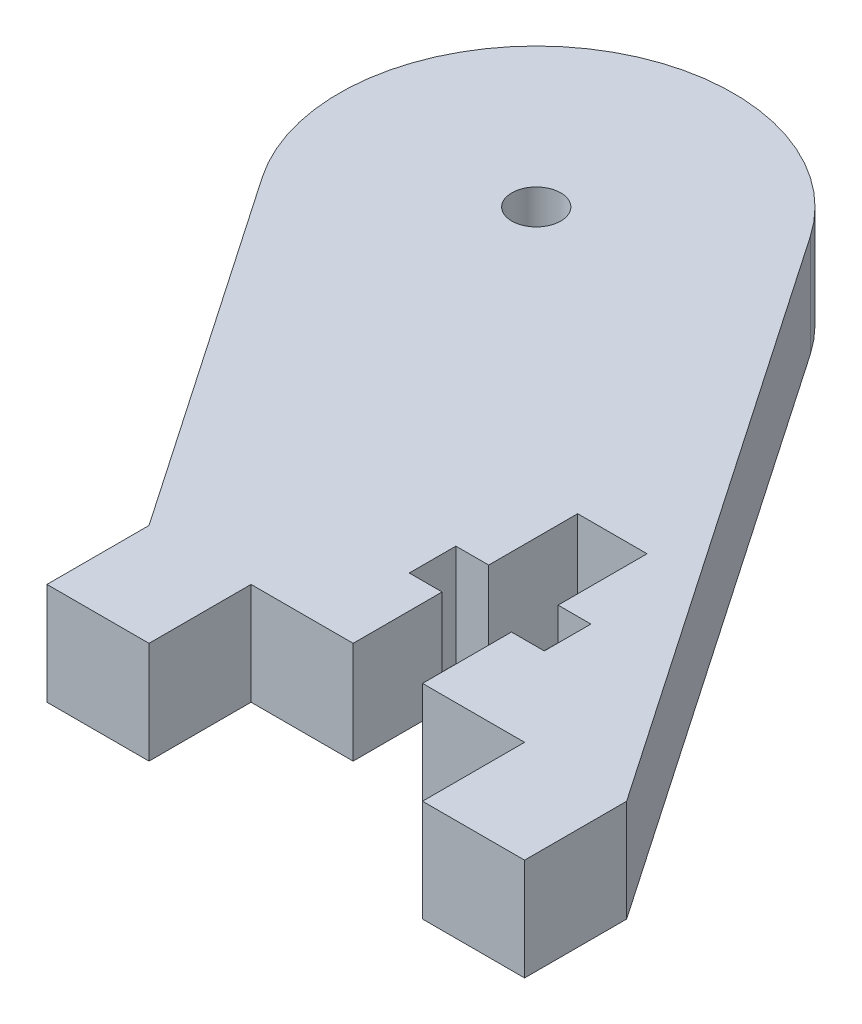
ISO-10303-21;
HEADER;
FILE_DESCRIPTION(('STEP AP214'),'2;1');
FILE_NAME('part.step','',(''),(''),'','','');
FILE_SCHEMA(('AUTOMOTIVE_DESIGN { 1 0 10303 214 1 1 1 1 }'));
ENDSEC;
DATA;
#1=APPLICATION_CONTEXT('core data for automotive mechanical design processes');
#2=APPLICATION_PROTOCOL_DEFINITION('international standard','automotive_design',2000,#1);
#3=PRODUCT_CONTEXT('',#1,'mechanical');
#4=PRODUCT('Part','Part','',(#3));
#5=PRODUCT_RELATED_PRODUCT_CATEGORY('part','',(#4));
#6=PRODUCT_DEFINITION_FORMATION('','',#4);
#7=PRODUCT_DEFINITION_CONTEXT('part definition',#1,'design');
#8=PRODUCT_DEFINITION('design','',#6,#7);
#9=PRODUCT_DEFINITION_SHAPE('','',#8);
#10=(LENGTH_UNIT() NAMED_UNIT(*) SI_UNIT(.MILLI.,.METRE.));
#11=(NAMED_UNIT(*) PLANE_ANGLE_UNIT() SI_UNIT($,.RADIAN.));
#12=(NAMED_UNIT(*) SI_UNIT($,.STERADIAN.) SOLID_ANGLE_UNIT());
#13=UNCERTAINTY_MEASURE_WITH_UNIT(LENGTH_MEASURE(1.E-05),#10,'distance_accuracy_value','');
#14=(GEOMETRIC_REPRESENTATION_CONTEXT(3) GLOBAL_UNCERTAINTY_ASSIGNED_CONTEXT((#13)) GLOBAL_UNIT_ASSIGNED_CONTEXT((#10,
#11,#12)) REPRESENTATION_CONTEXT('',''));
#15=CARTESIAN_POINT('',(0.,0.,0.));
#16=DIRECTION('',(0.,0.,1.));
#17=DIRECTION('',(1.,0.,0.));
#18=AXIS2_PLACEMENT_3D('',#15,#16,#17);
#19=CARTESIAN_POINT('',(0.,6.35,0.));
#20=DIRECTION('',(0.,0.,1.));
#21=DIRECTION('',(1.,0.,0.));
#22=AXIS2_PLACEMENT_3D('',#19,#20,#21);
#23=PLANE('',#22);
#24=DIRECTION('',(-1.,0.,0.));
#25=VECTOR('',#24,1.);
#26=CARTESIAN_POINT('',(0.,0.,0.));
#27=LINE('',#26,#25);
#28=CARTESIAN_POINT('',(23.368,0.,0.));
#29=VERTEX_POINT('',#28);
#30=CARTESIAN_POINT('',(17.018,0.,0.));
#31=VERTEX_POINT('',#30);
#32=EDGE_CURVE('E272',#29,#31,#27,.T.);
#33=ORIENTED_EDGE('',*,*,#32,.F.);
#34=DIRECTION('',(0.,-1.,0.));
#35=VECTOR('',#34,1.);
#36=CARTESIAN_POINT('',(23.368,6.35,0.));
#37=LINE('',#36,#35);
#38=CARTESIAN_POINT('',(23.368,6.35,0.));
#39=VERTEX_POINT('',#38);
#40=EDGE_CURVE('E11',#39,#29,#37,.T.);
#41=ORIENTED_EDGE('',*,*,#40,.F.);
#42=DIRECTION('',(-1.,0.,0.));
#43=VECTOR('',#42,1.);
#44=CARTESIAN_POINT('',(0.,6.35,0.));
#45=LINE('',#44,#43);
#46=CARTESIAN_POINT('',(17.018,6.35,0.));
#47=VERTEX_POINT('',#46);
#48=EDGE_CURVE('E429',#39,#47,#45,.T.);
#49=ORIENTED_EDGE('',*,*,#48,.T.);
#50=DIRECTION('',(0.,-1.,0.));
#51=VECTOR('',#50,1.);
#52=CARTESIAN_POINT('',(17.018,6.35,0.));
#53=LINE('',#52,#51);
#54=EDGE_CURVE('E128',#47,#31,#53,.T.);
#55=ORIENTED_EDGE('',*,*,#54,.T.);
#56=EDGE_LOOP('',(#33,#41,#49,#55));
#57=FACE_BOUND('',#56,.T.);
#58=ADVANCED_FACE('F35',(#57),#23,.T.);
#59=CARTESIAN_POINT('',(23.368,6.35,0.));
#60=DIRECTION('',(1.,0.,0.));
#61=DIRECTION('',(0.,0.,-1.));
#62=AXIS2_PLACEMENT_3D('',#59,#60,#61);
#63=PLANE('',#62);
#64=DIRECTION('',(0.,0.,1.));
#65=VECTOR('',#64,1.);
#66=CARTESIAN_POINT('',(23.368,0.,0.));
#67=LINE('',#66,#65);
#68=CARTESIAN_POINT('',(23.368,0.,6.35000000000002));
#69=VERTEX_POINT('',#68);
#70=EDGE_CURVE('E270',#29,#69,#67,.T.);
#71=ORIENTED_EDGE('',*,*,#70,.T.);
#72=DIRECTION('',(0.,-1.,0.));
#73=VECTOR('',#72,1.);
#74=CARTESIAN_POINT('',(23.368,6.35,6.35000000000002));
#75=LINE('',#74,#73);
#76=CARTESIAN_POINT('',(23.368,6.35,6.35000000000002));
#77=VERTEX_POINT('',#76);
#78=EDGE_CURVE('E44',#77,#69,#75,.T.);
#79=ORIENTED_EDGE('',*,*,#78,.F.);
#80=DIRECTION('',(0.,0.,1.));
#81=VECTOR('',#80,1.);
#82=CARTESIAN_POINT('',(23.368,6.35,0.));
#83=LINE('',#82,#81);
#84=EDGE_CURVE('E431',#39,#77,#83,.T.);
#85=ORIENTED_EDGE('',*,*,#84,.F.);
#86=ORIENTED_EDGE('',*,*,#40,.T.);
#87=EDGE_LOOP('',(#71,#79,#85,#86));
#88=FACE_BOUND('',#87,.T.);
#89=ADVANCED_FACE('F271',(#88),#63,.F.);
#90=CARTESIAN_POINT('',(0.,6.35,6.35));
#91=DIRECTION('',(0.,0.,-1.));
#92=DIRECTION('',(-1.,0.,0.));
#93=AXIS2_PLACEMENT_3D('',#90,#91,#92);
#94=PLANE('',#93);
#95=DIRECTION('',(1.,0.,0.));
#96=VECTOR('',#95,1.);
#97=CARTESIAN_POINT('',(0.,0.,6.35));
#98=LINE('',#97,#96);
#99=CARTESIAN_POINT('',(29.718,0.,6.35000000000002));
#100=VERTEX_POINT('',#99);
#101=EDGE_CURVE('E264',#69,#100,#98,.T.);
#102=ORIENTED_EDGE('',*,*,#101,.T.);
#103=DIRECTION('',(0.,-1.,0.));
#104=VECTOR('',#103,1.);
#105=CARTESIAN_POINT('',(29.718,6.35,6.35000000000002));
#106=LINE('',#105,#104);
#107=CARTESIAN_POINT('',(29.718,6.35,6.35000000000002));
#108=VERTEX_POINT('',#107);
#109=EDGE_CURVE('E255',#108,#100,#106,.T.);
#110=ORIENTED_EDGE('',*,*,#109,.F.);
#111=DIRECTION('',(1.,0.,0.));
#112=VECTOR('',#111,1.);
#113=CARTESIAN_POINT('',(0.,6.35,6.35));
#114=LINE('',#113,#112);
#115=EDGE_CURVE('E266',#77,#108,#114,.T.);
#116=ORIENTED_EDGE('',*,*,#115,.F.);
#117=ORIENTED_EDGE('',*,*,#78,.T.);
#118=EDGE_LOOP('',(#102,#110,#116,#117));
#119=FACE_BOUND('',#118,.T.);
#120=ADVANCED_FACE('F262',(#119),#94,.F.);
#121=CARTESIAN_POINT('',(29.718,6.35,0.));
#122=DIRECTION('',(-1.,0.,0.));
#123=DIRECTION('',(0.,0.,1.));
#124=AXIS2_PLACEMENT_3D('',#121,#122,#123);
#125=PLANE('',#124);
#126=DIRECTION('',(0.,0.,-1.));
#127=VECTOR('',#126,1.);
#128=CARTESIAN_POINT('',(29.718,0.,0.));
#129=LINE('',#128,#127);
#130=CARTESIAN_POINT('',(29.718,0.,0.));
#131=VERTEX_POINT('',#130);
#132=EDGE_CURVE('E274',#100,#131,#129,.T.);
#133=ORIENTED_EDGE('',*,*,#132,.T.);
#134=DIRECTION('',(0.,-1.,0.));
#135=VECTOR('',#134,1.);
#136=CARTESIAN_POINT('',(29.718,6.35,0.));
#137=LINE('',#136,#135);
#138=CARTESIAN_POINT('',(29.718,6.35,0.));
#139=VERTEX_POINT('',#138);
#140=EDGE_CURVE('E252',#139,#131,#137,.T.);
#141=ORIENTED_EDGE('',*,*,#140,.F.);
#142=DIRECTION('',(0.,0.,-1.));
#143=VECTOR('',#142,1.);
#144=CARTESIAN_POINT('',(29.718,6.35,0.));
#145=LINE('',#144,#143);
#146=EDGE_CURVE('E436',#108,#139,#145,.T.);
#147=ORIENTED_EDGE('',*,*,#146,.F.);
#148=ORIENTED_EDGE('',*,*,#109,.T.);
#149=EDGE_LOOP('',(#133,#141,#147,#148));
#150=FACE_BOUND('',#149,.T.);
#151=ADVANCED_FACE('F356',(#150),#125,.F.);
#152=CARTESIAN_POINT('',(20.2492592973143,6.35,-13.8468402788404));
#153=DIRECTION('',(-0.82545762131413,0.,0.564464095770864));
#154=DIRECTION('',(0.564464095770864,0.,0.82545762131413));
#155=AXIS2_PLACEMENT_3D('',#152,#153,#154);
#156=PLANE('',#155);
#157=DIRECTION('',(-0.564464095770864,0.,-0.82545762131413));
#158=VECTOR('',#157,1.);
#159=CARTESIAN_POINT('',(20.2492592973143,0.,-13.8468402788404));
#160=LINE('',#159,#158);
#161=CARTESIAN_POINT('',(5.00925929731432,0.,-36.1334201394202));
#162=VERTEX_POINT('',#161);
#163=EDGE_CURVE('E282',#131,#162,#160,.T.);
#164=ORIENTED_EDGE('',*,*,#163,.T.);
#165=DIRECTION('',(0.,-1.,0.));
#166=VECTOR('',#165,1.);
#167=CARTESIAN_POINT('',(5.00925929731432,6.35,-36.1334201394202));
#168=LINE('',#167,#166);
#169=CARTESIAN_POINT('',(5.00925929731432,6.35,-36.1334201394202));
#170=VERTEX_POINT('',#169);
#171=EDGE_CURVE('E250',#170,#162,#168,.T.);
#172=ORIENTED_EDGE('',*,*,#171,.F.);
#173=DIRECTION('',(-0.564464095770864,0.,-0.82545762131413));
#174=VECTOR('',#173,1.);
#175=CARTESIAN_POINT('',(20.2492592973143,6.35,-13.8468402788404));
#176=LINE('',#175,#174);
#177=EDGE_CURVE('E439',#139,#170,#176,.T.);
#178=ORIENTED_EDGE('',*,*,#177,.F.);
#179=ORIENTED_EDGE('',*,*,#140,.T.);
#180=EDGE_LOOP('',(#164,#172,#178,#179));
#181=FACE_BOUND('',#180,.T.);
#182=ADVANCED_FACE('F359',(#181),#156,.F.);
#183=CARTESIAN_POINT('',(-5.11537035134283,6.35,-29.21));
#184=DIRECTION('',(0.,-1.,0.));
#185=DIRECTION('',(0.,0.,-1.));
#186=AXIS2_PLACEMENT_3D('',#183,#184,#185);
#187=CYLINDRICAL_SURFACE('',#186,12.2654747951066);
#188=CARTESIAN_POINT('',(-5.11537035134283,0.,-29.21));
#189=DIRECTION('',(0.,1.,0.));
#190=DIRECTION('',(0.,0.,1.));
#191=AXIS2_PLACEMENT_3D('',#188,#189,#190);
#192=CIRCLE('',#191,12.2654747951066);
#193=CARTESIAN_POINT('',(-15.24,0.,-22.2865798605798));
#194=VERTEX_POINT('',#193);
#195=EDGE_CURVE('E285',#194,#162,#192,.F.);
#196=ORIENTED_EDGE('',*,*,#195,.F.);
#197=DIRECTION('',(0.,-1.,0.));
#198=VECTOR('',#197,1.);
#199=CARTESIAN_POINT('',(-15.24,6.35,-22.2865798605798));
#200=LINE('',#199,#198);
#201=CARTESIAN_POINT('',(-15.24,6.35,-22.2865798605798));
#202=VERTEX_POINT('',#201);
#203=EDGE_CURVE('E248',#202,#194,#200,.T.);
#204=ORIENTED_EDGE('',*,*,#203,.F.);
#205=CARTESIAN_POINT('',(-5.11537035134283,6.35,-29.21));
#206=DIRECTION('',(0.,1.,0.));
#207=DIRECTION('',(0.,0.,1.));
#208=AXIS2_PLACEMENT_3D('',#205,#206,#207);
#209=CIRCLE('',#208,12.2654747951066);
#210=EDGE_CURVE('E441',#202,#170,#209,.F.);
#211=ORIENTED_EDGE('',*,*,#210,.T.);
#212=ORIENTED_EDGE('',*,*,#171,.T.);
#213=EDGE_LOOP('',(#196,#204,#211,#212));
#214=FACE_BOUND('',#213,.T.);
#215=ADVANCED_FACE('F363',(#214),#187,.T.);
#216=CARTESIAN_POINT('',(0.,6.35,0.));
#217=DIRECTION('',(-0.82545762131413,0.,0.564464095770864));
#218=DIRECTION('',(0.564464095770864,0.,0.82545762131413));
#219=AXIS2_PLACEMENT_3D('',#216,#217,#218);
#220=PLANE('',#219);
#221=DIRECTION('',(-0.564464095770864,0.,-0.82545762131413));
#222=VECTOR('',#221,1.);
#223=CARTESIAN_POINT('',(0.,0.,0.));
#224=LINE('',#223,#222);
#225=CARTESIAN_POINT('',(0.,0.,0.));
#226=VERTEX_POINT('',#225);
#227=EDGE_CURVE('E288',#226,#194,#224,.T.);
#228=ORIENTED_EDGE('',*,*,#227,.F.);
#229=DIRECTION('',(0.,-1.,0.));
#230=VECTOR('',#229,1.);
#231=CARTESIAN_POINT('',(0.,6.35,0.));
#232=LINE('',#231,#230);
#233=CARTESIAN_POINT('',(0.,6.35,0.));
#234=VERTEX_POINT('',#233);
#235=EDGE_CURVE('E246',#234,#226,#232,.T.);
#236=ORIENTED_EDGE('',*,*,#235,.F.);
#237=DIRECTION('',(-0.564464095770864,0.,-0.82545762131413));
#238=VECTOR('',#237,1.);
#239=CARTESIAN_POINT('',(0.,6.35,0.));
#240=LINE('',#239,#238);
#241=EDGE_CURVE('E444',#234,#202,#240,.T.);
#242=ORIENTED_EDGE('',*,*,#241,.T.);
#243=ORIENTED_EDGE('',*,*,#203,.T.);
#244=EDGE_LOOP('',(#228,#236,#242,#243));
#245=FACE_BOUND('',#244,.T.);
#246=ADVANCED_FACE('F367',(#245),#220,.T.);
#247=CARTESIAN_POINT('',(0.,6.35,0.));
#248=DIRECTION('',(-1.,0.,0.));
#249=DIRECTION('',(0.,0.,1.));
#250=AXIS2_PLACEMENT_3D('',#247,#248,#249);
#251=PLANE('',#250);
#252=DIRECTION('',(0.,0.,-1.));
#253=VECTOR('',#252,1.);
#254=CARTESIAN_POINT('',(0.,0.,0.));
#255=LINE('',#254,#253);
#256=CARTESIAN_POINT('',(0.,0.,6.35));
#257=VERTEX_POINT('',#256);
#258=EDGE_CURVE('E291',#257,#226,#255,.T.);
#259=ORIENTED_EDGE('',*,*,#258,.F.);
#260=DIRECTION('',(0.,-1.,0.));
#261=VECTOR('',#260,1.);
#262=CARTESIAN_POINT('',(0.,6.35,6.35));
#263=LINE('',#262,#261);
#264=CARTESIAN_POINT('',(0.,6.35,6.35));
#265=VERTEX_POINT('',#264);
#266=EDGE_CURVE('E244',#265,#257,#263,.T.);
#267=ORIENTED_EDGE('',*,*,#266,.F.);
#268=DIRECTION('',(0.,0.,-1.));
#269=VECTOR('',#268,1.);
#270=CARTESIAN_POINT('',(0.,6.35,0.));
#271=LINE('',#270,#269);
#272=EDGE_CURVE('E447',#265,#234,#271,.T.);
#273=ORIENTED_EDGE('',*,*,#272,.T.);
#274=ORIENTED_EDGE('',*,*,#235,.T.);
#275=EDGE_LOOP('',(#259,#267,#273,#274));
#276=FACE_BOUND('',#275,.T.);
#277=ADVANCED_FACE('F371',(#276),#251,.T.);
#278=CARTESIAN_POINT('',(0.,6.35,6.35));
#279=DIRECTION('',(0.,0.,1.));
#280=DIRECTION('',(1.,0.,0.));
#281=AXIS2_PLACEMENT_3D('',#278,#279,#280);
#282=PLANE('',#281);
#283=DIRECTION('',(-1.,0.,0.));
#284=VECTOR('',#283,1.);
#285=CARTESIAN_POINT('',(0.,0.,6.35));
#286=LINE('',#285,#284);
#287=CARTESIAN_POINT('',(6.35,0.,6.35));
#288=VERTEX_POINT('',#287);
#289=EDGE_CURVE('E294',#288,#257,#286,.T.);
#290=ORIENTED_EDGE('',*,*,#289,.F.);
#291=DIRECTION('',(0.,-1.,0.));
#292=VECTOR('',#291,1.);
#293=CARTESIAN_POINT('',(6.35,6.35,6.35));
#294=LINE('',#293,#292);
#295=CARTESIAN_POINT('',(6.35,6.35,6.35));
#296=VERTEX_POINT('',#295);
#297=EDGE_CURVE('E242',#296,#288,#294,.T.);
#298=ORIENTED_EDGE('',*,*,#297,.F.);
#299=DIRECTION('',(-1.,0.,0.));
#300=VECTOR('',#299,1.);
#301=CARTESIAN_POINT('',(0.,6.35,6.35));
#302=LINE('',#301,#300);
#303=EDGE_CURVE('E450',#296,#265,#302,.T.);
#304=ORIENTED_EDGE('',*,*,#303,.T.);
#305=ORIENTED_EDGE('',*,*,#266,.T.);
#306=EDGE_LOOP('',(#290,#298,#304,#305));
#307=FACE_BOUND('',#306,.T.);
#308=ADVANCED_FACE('F375',(#307),#282,.T.);
#309=CARTESIAN_POINT('',(6.35,6.35,0.));
#310=DIRECTION('',(1.,0.,0.));
#311=DIRECTION('',(0.,0.,-1.));
#312=AXIS2_PLACEMENT_3D('',#309,#310,#311);
#313=PLANE('',#312);
#314=DIRECTION('',(0.,0.,1.));
#315=VECTOR('',#314,1.);
#316=CARTESIAN_POINT('',(6.35,0.,0.));
#317=LINE('',#316,#315);
#318=CARTESIAN_POINT('',(6.35,0.,0.));
#319=VERTEX_POINT('',#318);
#320=EDGE_CURVE('E297',#319,#288,#317,.T.);
#321=ORIENTED_EDGE('',*,*,#320,.F.);
#322=DIRECTION('',(0.,-1.,0.));
#323=VECTOR('',#322,1.);
#324=CARTESIAN_POINT('',(6.35,6.35,0.));
#325=LINE('',#324,#323);
#326=CARTESIAN_POINT('',(6.35,6.35,0.));
#327=VERTEX_POINT('',#326);
#328=EDGE_CURVE('E240',#327,#319,#325,.T.);
#329=ORIENTED_EDGE('',*,*,#328,.F.);
#330=DIRECTION('',(0.,0.,1.));
#331=VECTOR('',#330,1.);
#332=CARTESIAN_POINT('',(6.35,6.35,0.));
#333=LINE('',#332,#331);
#334=EDGE_CURVE('E453',#327,#296,#333,.T.);
#335=ORIENTED_EDGE('',*,*,#334,.T.);
#336=ORIENTED_EDGE('',*,*,#297,.T.);
#337=EDGE_LOOP('',(#321,#329,#335,#336));
#338=FACE_BOUND('',#337,.T.);
#339=ADVANCED_FACE('F379',(#338),#313,.T.);
#340=CARTESIAN_POINT('',(0.,6.35,0.));
#341=DIRECTION('',(0.,0.,-1.));
#342=DIRECTION('',(-1.,0.,0.));
#343=AXIS2_PLACEMENT_3D('',#340,#341,#342);
#344=PLANE('',#343);
#345=DIRECTION('',(1.,0.,0.));
#346=VECTOR('',#345,1.);
#347=CARTESIAN_POINT('',(0.,0.,0.));
#348=LINE('',#347,#346);
#349=CARTESIAN_POINT('',(12.7,0.,0.));
#350=VERTEX_POINT('',#349);
#351=EDGE_CURVE('E300',#319,#350,#348,.T.);
#352=ORIENTED_EDGE('',*,*,#351,.T.);
#353=DIRECTION('',(0.,-1.,0.));
#354=VECTOR('',#353,1.);
#355=CARTESIAN_POINT('',(12.7,6.35,0.));
#356=LINE('',#355,#354);
#357=CARTESIAN_POINT('',(12.7,6.35,0.));
#358=VERTEX_POINT('',#357);
#359=EDGE_CURVE('E237',#358,#350,#356,.T.);
#360=ORIENTED_EDGE('',*,*,#359,.F.);
#361=DIRECTION('',(1.,0.,0.));
#362=VECTOR('',#361,1.);
#363=CARTESIAN_POINT('',(0.,6.35,0.));
#364=LINE('',#363,#362);
#365=EDGE_CURVE('E456',#327,#358,#364,.T.);
#366=ORIENTED_EDGE('',*,*,#365,.F.);
#367=ORIENTED_EDGE('',*,*,#328,.T.);
#368=EDGE_LOOP('',(#352,#360,#366,#367));
#369=FACE_BOUND('',#368,.T.);
#370=ADVANCED_FACE('F383',(#369),#344,.F.);
#371=CARTESIAN_POINT('',(12.7,6.35,0.));
#372=DIRECTION('',(-1.,0.,0.));
#373=DIRECTION('',(0.,0.,1.));
#374=AXIS2_PLACEMENT_3D('',#371,#372,#373);
#375=PLANE('',#374);
#376=DIRECTION('',(0.,0.,-1.));
#377=VECTOR('',#376,1.);
#378=CARTESIAN_POINT('',(12.7,0.,0.));
#379=LINE('',#378,#377);
#380=CARTESIAN_POINT('',(12.7,0.,-5.53499997899999));
#381=VERTEX_POINT('',#380);
#382=EDGE_CURVE('E303',#350,#381,#379,.T.);
#383=ORIENTED_EDGE('',*,*,#382,.T.);
#384=DIRECTION('',(0.,-1.,0.));
#385=VECTOR('',#384,1.);
#386=CARTESIAN_POINT('',(12.7,6.35,-5.53499997899999));
#387=LINE('',#386,#385);
#388=CARTESIAN_POINT('',(12.7,6.35,-5.53499997899999));
#389=VERTEX_POINT('',#388);
#390=EDGE_CURVE('E234',#389,#381,#387,.T.);
#391=ORIENTED_EDGE('',*,*,#390,.F.);
#392=DIRECTION('',(0.,0.,-1.));
#393=VECTOR('',#392,1.);
#394=CARTESIAN_POINT('',(12.7,6.35,0.));
#395=LINE('',#394,#393);
#396=EDGE_CURVE('E459',#358,#389,#395,.T.);
#397=ORIENTED_EDGE('',*,*,#396,.F.);
#398=ORIENTED_EDGE('',*,*,#359,.T.);
#399=EDGE_LOOP('',(#383,#391,#397,#398));
#400=FACE_BOUND('',#399,.T.);
#401=ADVANCED_FACE('F387',(#400),#375,.F.);
#402=CARTESIAN_POINT('',(0.,6.35,-5.53499997899999));
#403=DIRECTION('',(0.,0.,1.));
#404=DIRECTION('',(1.,0.,0.));
#405=AXIS2_PLACEMENT_3D('',#402,#403,#404);
#406=PLANE('',#405);
#407=DIRECTION('',(-1.,0.,0.));
#408=VECTOR('',#407,1.);
#409=CARTESIAN_POINT('',(0.,0.,-5.53499997899999));
#410=LINE('',#409,#408);
#411=CARTESIAN_POINT('',(10.659000018,0.,-5.53499997899999));
#412=VERTEX_POINT('',#411);
#413=EDGE_CURVE('E306',#381,#412,#410,.T.);
#414=ORIENTED_EDGE('',*,*,#413,.T.);
#415=DIRECTION('',(0.,-1.,0.));
#416=VECTOR('',#415,1.);
#417=CARTESIAN_POINT('',(10.659000018,6.35,-5.53499997899999));
#418=LINE('',#417,#416);
#419=CARTESIAN_POINT('',(10.659000018,6.35,-5.53499997899999));
#420=VERTEX_POINT('',#419);
#421=EDGE_CURVE('E231',#420,#412,#418,.T.);
#422=ORIENTED_EDGE('',*,*,#421,.F.);
#423=DIRECTION('',(-1.,0.,0.));
#424=VECTOR('',#423,1.);
#425=CARTESIAN_POINT('',(0.,6.35,-5.53499997899999));
#426=LINE('',#425,#424);
#427=EDGE_CURVE('E462',#389,#420,#426,.T.);
#428=ORIENTED_EDGE('',*,*,#427,.F.);
#429=ORIENTED_EDGE('',*,*,#390,.T.);
#430=EDGE_LOOP('',(#414,#422,#428,#429));
#431=FACE_BOUND('',#430,.T.);
#432=ADVANCED_FACE('F391',(#431),#406,.F.);
#433=CARTESIAN_POINT('',(10.659000018,6.35,0.));
#434=DIRECTION('',(-1.,0.,0.));
#435=DIRECTION('',(0.,0.,1.));
#436=AXIS2_PLACEMENT_3D('',#433,#434,#435);
#437=PLANE('',#436);
#438=DIRECTION('',(0.,0.,-1.));
#439=VECTOR('',#438,1.);
#440=CARTESIAN_POINT('',(10.659000018,0.,0.));
#441=LINE('',#440,#439);
#442=CARTESIAN_POINT('',(10.659000018,0.,-8.435000021));
#443=VERTEX_POINT('',#442);
#444=EDGE_CURVE('E309',#412,#443,#441,.T.);
#445=ORIENTED_EDGE('',*,*,#444,.T.);
#446=DIRECTION('',(0.,-1.,0.));
#447=VECTOR('',#446,1.);
#448=CARTESIAN_POINT('',(10.659000018,6.35,-8.435000021));
#449=LINE('',#448,#447);
#450=CARTESIAN_POINT('',(10.659000018,6.35,-8.435000021));
#451=VERTEX_POINT('',#450);
#452=EDGE_CURVE('E228',#451,#443,#449,.T.);
#453=ORIENTED_EDGE('',*,*,#452,.F.);
#454=DIRECTION('',(0.,0.,-1.));
#455=VECTOR('',#454,1.);
#456=CARTESIAN_POINT('',(10.659000018,6.35,0.));
#457=LINE('',#456,#455);
#458=EDGE_CURVE('E465',#420,#451,#457,.T.);
#459=ORIENTED_EDGE('',*,*,#458,.F.);
#460=ORIENTED_EDGE('',*,*,#421,.T.);
#461=EDGE_LOOP('',(#445,#453,#459,#460));
#462=FACE_BOUND('',#461,.T.);
#463=ADVANCED_FACE('F395',(#462),#437,.F.);
#464=CARTESIAN_POINT('',(0.,6.35,-8.43500002100001));
#465=DIRECTION('',(0.,0.,-1.));
#466=DIRECTION('',(-1.,0.,0.));
#467=AXIS2_PLACEMENT_3D('',#464,#465,#466);
#468=PLANE('',#467);
#469=DIRECTION('',(1.,0.,0.));
#470=VECTOR('',#469,1.);
#471=CARTESIAN_POINT('',(0.,0.,-8.43500002100001));
#472=LINE('',#471,#470);
#473=CARTESIAN_POINT('',(12.7,0.,-8.435000021));
#474=VERTEX_POINT('',#473);
#475=EDGE_CURVE('E312',#443,#474,#472,.T.);
#476=ORIENTED_EDGE('',*,*,#475,.T.);
#477=DIRECTION('',(0.,-1.,0.));
#478=VECTOR('',#477,1.);
#479=CARTESIAN_POINT('',(12.7,6.35,-8.435000021));
#480=LINE('',#479,#478);
#481=CARTESIAN_POINT('',(12.7,6.35,-8.435000021));
#482=VERTEX_POINT('',#481);
#483=EDGE_CURVE('E225',#482,#474,#480,.T.);
#484=ORIENTED_EDGE('',*,*,#483,.F.);
#485=DIRECTION('',(1.,0.,0.));
#486=VECTOR('',#485,1.);
#487=CARTESIAN_POINT('',(0.,6.35,-8.43500002100001));
#488=LINE('',#487,#486);
#489=EDGE_CURVE('E468',#451,#482,#488,.T.);
#490=ORIENTED_EDGE('',*,*,#489,.F.);
#491=ORIENTED_EDGE('',*,*,#452,.T.);
#492=EDGE_LOOP('',(#476,#484,#490,#491));
#493=FACE_BOUND('',#492,.T.);
#494=ADVANCED_FACE('F399',(#493),#468,.F.);
#495=CARTESIAN_POINT('',(12.7,6.35,0.));
#496=DIRECTION('',(-1.,0.,0.));
#497=DIRECTION('',(0.,0.,1.));
#498=AXIS2_PLACEMENT_3D('',#495,#496,#497);
#499=PLANE('',#498);
#500=DIRECTION('',(0.,0.,-1.));
#501=VECTOR('',#500,1.);
#502=CARTESIAN_POINT('',(12.7,0.,0.));
#503=LINE('',#502,#501);
#504=CARTESIAN_POINT('',(12.7,0.,-13.97));
#505=VERTEX_POINT('',#504);
#506=EDGE_CURVE('E315',#474,#505,#503,.T.);
#507=ORIENTED_EDGE('',*,*,#506,.T.);
#508=DIRECTION('',(0.,-1.,0.));
#509=VECTOR('',#508,1.);
#510=CARTESIAN_POINT('',(12.7,6.35,-13.97));
#511=LINE('',#510,#509);
#512=CARTESIAN_POINT('',(12.7,6.35,-13.97));
#513=VERTEX_POINT('',#512);
#514=EDGE_CURVE('E222',#513,#505,#511,.T.);
#515=ORIENTED_EDGE('',*,*,#514,.F.);
#516=DIRECTION('',(0.,0.,-1.));
#517=VECTOR('',#516,1.);
#518=CARTESIAN_POINT('',(12.7,6.35,0.));
#519=LINE('',#518,#517);
#520=EDGE_CURVE('E471',#482,#513,#519,.T.);
#521=ORIENTED_EDGE('',*,*,#520,.F.);
#522=ORIENTED_EDGE('',*,*,#483,.T.);
#523=EDGE_LOOP('',(#507,#515,#521,#522));
#524=FACE_BOUND('',#523,.T.);
#525=ADVANCED_FACE('F403',(#524),#499,.F.);
#526=CARTESIAN_POINT('',(0.,6.35,-13.97));
#527=DIRECTION('',(0.,0.,-1.));
#528=DIRECTION('',(-1.,0.,0.));
#529=AXIS2_PLACEMENT_3D('',#526,#527,#528);
#530=PLANE('',#529);
#531=DIRECTION('',(1.,0.,0.));
#532=VECTOR('',#531,1.);
#533=CARTESIAN_POINT('',(0.,0.,-13.97));
#534=LINE('',#533,#532);
#535=CARTESIAN_POINT('',(17.018,0.,-13.97));
#536=VERTEX_POINT('',#535);
#537=EDGE_CURVE('E318',#505,#536,#534,.T.);
#538=ORIENTED_EDGE('',*,*,#537,.T.);
#539=DIRECTION('',(0.,-1.,0.));
#540=VECTOR('',#539,1.);
#541=CARTESIAN_POINT('',(17.018,6.35,-13.97));
#542=LINE('',#541,#540);
#543=CARTESIAN_POINT('',(17.018,6.35,-13.97));
#544=VERTEX_POINT('',#543);
#545=EDGE_CURVE('E219',#544,#536,#542,.T.);
#546=ORIENTED_EDGE('',*,*,#545,.F.);
#547=DIRECTION('',(1.,0.,0.));
#548=VECTOR('',#547,1.);
#549=CARTESIAN_POINT('',(0.,6.35,-13.97));
#550=LINE('',#549,#548);
#551=EDGE_CURVE('E474',#513,#544,#550,.T.);
#552=ORIENTED_EDGE('',*,*,#551,.F.);
#553=ORIENTED_EDGE('',*,*,#514,.T.);
#554=EDGE_LOOP('',(#538,#546,#552,#553));
#555=FACE_BOUND('',#554,.T.);
#556=ADVANCED_FACE('F407',(#555),#530,.F.);
#557=CARTESIAN_POINT('',(17.018,6.35,0.));
#558=DIRECTION('',(1.,0.,0.));
#559=DIRECTION('',(0.,0.,-1.));
#560=AXIS2_PLACEMENT_3D('',#557,#558,#559);
#561=PLANE('',#560);
#562=DIRECTION('',(0.,0.,1.));
#563=VECTOR('',#562,1.);
#564=CARTESIAN_POINT('',(17.018,0.,0.));
#565=LINE('',#564,#563);
#566=CARTESIAN_POINT('',(17.018,0.,-8.43500002099999));
#567=VERTEX_POINT('',#566);
#568=EDGE_CURVE('E321',#536,#567,#565,.T.);
#569=ORIENTED_EDGE('',*,*,#568,.T.);
#570=DIRECTION('',(0.,-1.,0.));
#571=VECTOR('',#570,1.);
#572=CARTESIAN_POINT('',(17.018,6.35,-8.43500002099999));
#573=LINE('',#572,#571);
#574=CARTESIAN_POINT('',(17.018,6.35,-8.43500002099999));
#575=VERTEX_POINT('',#574);
#576=EDGE_CURVE('E212',#575,#567,#573,.T.);
#577=ORIENTED_EDGE('',*,*,#576,.F.);
#578=DIRECTION('',(0.,0.,1.));
#579=VECTOR('',#578,1.);
#580=CARTESIAN_POINT('',(17.018,6.35,0.));
#581=LINE('',#580,#579);
#582=EDGE_CURVE('E477',#544,#575,#581,.T.);
#583=ORIENTED_EDGE('',*,*,#582,.F.);
#584=ORIENTED_EDGE('',*,*,#545,.T.);
#585=EDGE_LOOP('',(#569,#577,#583,#584));
#586=FACE_BOUND('',#585,.T.);
#587=ADVANCED_FACE('F411',(#586),#561,.F.);
#588=CARTESIAN_POINT('',(0.,6.35,-8.43500002100001));
#589=DIRECTION('',(0.,0.,-1.));
#590=DIRECTION('',(-1.,0.,0.));
#591=AXIS2_PLACEMENT_3D('',#588,#589,#590);
#592=PLANE('',#591);
#593=DIRECTION('',(1.,0.,0.));
#594=VECTOR('',#593,1.);
#595=CARTESIAN_POINT('',(0.,0.,-8.43500002100001));
#596=LINE('',#595,#594);
#597=CARTESIAN_POINT('',(19.058999982,0.,-8.43500002099999));
#598=VERTEX_POINT('',#597);
#599=EDGE_CURVE('E324',#567,#598,#596,.T.);
#600=ORIENTED_EDGE('',*,*,#599,.T.);
#601=DIRECTION('',(0.,-1.,0.));
#602=VECTOR('',#601,1.);
#603=CARTESIAN_POINT('',(19.058999982,6.35,-8.43500002099999));
#604=LINE('',#603,#602);
#605=CARTESIAN_POINT('',(19.058999982,6.35,-8.43500002099999));
#606=VERTEX_POINT('',#605);
#607=EDGE_CURVE('E210',#606,#598,#604,.T.);
#608=ORIENTED_EDGE('',*,*,#607,.F.);
#609=DIRECTION('',(1.,0.,0.));
#610=VECTOR('',#609,1.);
#611=CARTESIAN_POINT('',(0.,6.35,-8.43500002100001));
#612=LINE('',#611,#610);
#613=EDGE_CURVE('E203',#575,#606,#612,.T.);
#614=ORIENTED_EDGE('',*,*,#613,.F.);
#615=ORIENTED_EDGE('',*,*,#576,.T.);
#616=EDGE_LOOP('',(#600,#608,#614,#615));
#617=FACE_BOUND('',#616,.T.);
#618=ADVANCED_FACE('F415',(#617),#592,.F.);
#619=CARTESIAN_POINT('',(19.058999982,6.35,0.));
#620=DIRECTION('',(1.,0.,0.));
#621=DIRECTION('',(0.,0.,-1.));
#622=AXIS2_PLACEMENT_3D('',#619,#620,#621);
#623=PLANE('',#622);
#624=DIRECTION('',(0.,0.,1.));
#625=VECTOR('',#624,1.);
#626=CARTESIAN_POINT('',(19.058999982,0.,0.));
#627=LINE('',#626,#625);
#628=CARTESIAN_POINT('',(19.058999982,0.,-5.53499997899999));
#629=VERTEX_POINT('',#628);
#630=EDGE_CURVE('E209',#598,#629,#627,.T.);
#631=ORIENTED_EDGE('',*,*,#630,.T.);
#632=DIRECTION('',(0.,-1.,0.));
#633=VECTOR('',#632,1.);
#634=CARTESIAN_POINT('',(19.058999982,6.35,-5.53499997899999));
#635=LINE('',#634,#633);
#636=CARTESIAN_POINT('',(19.058999982,6.35,-5.53499997899999));
#637=VERTEX_POINT('',#636);
#638=EDGE_CURVE('E195',#637,#629,#635,.T.);
#639=ORIENTED_EDGE('',*,*,#638,.F.);
#640=DIRECTION('',(0.,0.,1.));
#641=VECTOR('',#640,1.);
#642=CARTESIAN_POINT('',(19.058999982,6.35,0.));
#643=LINE('',#642,#641);
#644=EDGE_CURVE('E198',#606,#637,#643,.T.);
#645=ORIENTED_EDGE('',*,*,#644,.F.);
#646=ORIENTED_EDGE('',*,*,#607,.T.);
#647=EDGE_LOOP('',(#631,#639,#645,#646));
#648=FACE_BOUND('',#647,.T.);
#649=ADVANCED_FACE('F208',(#648),#623,.F.);
#650=CARTESIAN_POINT('',(0.,6.35,-5.53499997900001));
#651=DIRECTION('',(0.,0.,1.));
#652=DIRECTION('',(1.,0.,0.));
#653=AXIS2_PLACEMENT_3D('',#650,#651,#652);
#654=PLANE('',#653);
#655=DIRECTION('',(-1.,0.,0.));
#656=VECTOR('',#655,1.);
#657=CARTESIAN_POINT('',(0.,0.,-5.53499997900001));
#658=LINE('',#657,#656);
#659=CARTESIAN_POINT('',(17.018,0.,-5.53499997899999));
#660=VERTEX_POINT('',#659);
#661=EDGE_CURVE('E328',#629,#660,#658,.T.);
#662=ORIENTED_EDGE('',*,*,#661,.T.);
#663=DIRECTION('',(0.,-1.,0.));
#664=VECTOR('',#663,1.);
#665=CARTESIAN_POINT('',(17.018,6.35,-5.53499997899999));
#666=LINE('',#665,#664);
#667=CARTESIAN_POINT('',(17.018,6.35,-5.53499997899999));
#668=VERTEX_POINT('',#667);
#669=EDGE_CURVE('E197',#668,#660,#666,.T.);
#670=ORIENTED_EDGE('',*,*,#669,.F.);
#671=DIRECTION('',(-1.,0.,0.));
#672=VECTOR('',#671,1.);
#673=CARTESIAN_POINT('',(0.,6.35,-5.53499997900001));
#674=LINE('',#673,#672);
#675=EDGE_CURVE('E190',#637,#668,#674,.T.);
#676=ORIENTED_EDGE('',*,*,#675,.F.);
#677=ORIENTED_EDGE('',*,*,#638,.T.);
#678=EDGE_LOOP('',(#662,#670,#676,#677));
#679=FACE_BOUND('',#678,.T.);
#680=ADVANCED_FACE('F193',(#679),#654,.F.);
#681=CARTESIAN_POINT('',(-5.11537035134283,6.35,-29.21));
#682=DIRECTION('',(0.,-1.,0.));
#683=DIRECTION('',(0.,0.,-1.));
#684=AXIS2_PLACEMENT_3D('',#681,#682,#683);
#685=CYLINDRICAL_SURFACE('',#684,1.52400000000001);
#686=CARTESIAN_POINT('',(-5.11537035134283,6.35,-29.21));
#687=DIRECTION('',(0.,1.,0.));
#688=DIRECTION('',(0.,0.,1.));
#689=AXIS2_PLACEMENT_3D('',#686,#687,#688);
#690=CIRCLE('',#689,1.52400000000001);
#691=CARTESIAN_POINT('',(-5.11537035134283,6.35,-27.686));
#692=VERTEX_POINT('',#691);
#693=EDGE_CURVE('E330',#692,#692,#690,.T.);
#694=ORIENTED_EDGE('',*,*,#693,.T.);
#695=EDGE_LOOP('',(#694));
#696=FACE_BOUND('',#695,.T.);
#697=CARTESIAN_POINT('',(-5.11537035134283,0.,-29.21));
#698=DIRECTION('',(0.,1.,0.));
#699=DIRECTION('',(0.,0.,1.));
#700=AXIS2_PLACEMENT_3D('',#697,#698,#699);
#701=CIRCLE('',#700,1.52400000000001);
#702=CARTESIAN_POINT('',(-5.11537035134283,0.,-27.686));
#703=VERTEX_POINT('',#702);
#704=EDGE_CURVE('E276',#703,#703,#701,.T.);
#705=ORIENTED_EDGE('',*,*,#704,.F.);
#706=EDGE_LOOP('',(#705));
#707=FACE_BOUND('',#706,.T.);
#708=ADVANCED_FACE('F37',(#696,#707),#685,.F.);
#709=CARTESIAN_POINT('',(17.018,6.35,0.));
#710=DIRECTION('',(1.,0.,0.));
#711=DIRECTION('',(0.,0.,-1.));
#712=AXIS2_PLACEMENT_3D('',#709,#710,#711);
#713=PLANE('',#712);
#714=DIRECTION('',(0.,0.,1.));
#715=VECTOR('',#714,1.);
#716=CARTESIAN_POINT('',(17.018,0.,0.));
#717=LINE('',#716,#715);
#718=EDGE_CURVE('E121',#660,#31,#717,.T.);
#719=ORIENTED_EDGE('',*,*,#718,.T.);
#720=ORIENTED_EDGE('',*,*,#54,.F.);
#721=DIRECTION('',(0.,0.,1.));
#722=VECTOR('',#721,1.);
#723=CARTESIAN_POINT('',(17.018,6.35,0.));
#724=LINE('',#723,#722);
#725=EDGE_CURVE('E52',#668,#47,#724,.T.);
#726=ORIENTED_EDGE('',*,*,#725,.F.);
#727=ORIENTED_EDGE('',*,*,#669,.T.);
#728=EDGE_LOOP('',(#719,#720,#726,#727));
#729=FACE_BOUND('',#728,.T.);
#730=ADVANCED_FACE('F338',(#729),#713,.F.);
#731=CARTESIAN_POINT('',(0.,6.35,0.));
#732=DIRECTION('',(0.,1.,0.));
#733=DIRECTION('',(0.,0.,1.));
#734=AXIS2_PLACEMENT_3D('',#731,#732,#733);
#735=PLANE('',#734);
#736=ORIENTED_EDGE('',*,*,#693,.F.);
#737=EDGE_LOOP('',(#736));
#738=FACE_BOUND('',#737,.T.);
#739=ORIENTED_EDGE('',*,*,#48,.F.);
#740=ORIENTED_EDGE('',*,*,#84,.T.);
#741=ORIENTED_EDGE('',*,*,#115,.T.);
#742=ORIENTED_EDGE('',*,*,#146,.T.);
#743=ORIENTED_EDGE('',*,*,#177,.T.);
#744=ORIENTED_EDGE('',*,*,#210,.F.);
#745=ORIENTED_EDGE('',*,*,#241,.F.);
#746=ORIENTED_EDGE('',*,*,#272,.F.);
#747=ORIENTED_EDGE('',*,*,#303,.F.);
#748=ORIENTED_EDGE('',*,*,#334,.F.);
#749=ORIENTED_EDGE('',*,*,#365,.T.);
#750=ORIENTED_EDGE('',*,*,#396,.T.);
#751=ORIENTED_EDGE('',*,*,#427,.T.);
#752=ORIENTED_EDGE('',*,*,#458,.T.);
#753=ORIENTED_EDGE('',*,*,#489,.T.);
#754=ORIENTED_EDGE('',*,*,#520,.T.);
#755=ORIENTED_EDGE('',*,*,#551,.T.);
#756=ORIENTED_EDGE('',*,*,#582,.T.);
#757=ORIENTED_EDGE('',*,*,#613,.T.);
#758=ORIENTED_EDGE('',*,*,#644,.T.);
#759=ORIENTED_EDGE('',*,*,#675,.T.);
#760=ORIENTED_EDGE('',*,*,#725,.T.);
#761=EDGE_LOOP('',(#739,#740,#741,#742,#743,#744,#745,#746,#747,#748,#749,#750,#751,#752,#753,
#754,#755,#756,#757,#758,#759,#760));
#762=FACE_BOUND('',#761,.T.);
#763=ADVANCED_FACE('F201',(#738,#762),#735,.T.);
#764=CARTESIAN_POINT('',(0.,0.,0.));
#765=DIRECTION('',(0.,1.,0.));
#766=DIRECTION('',(0.,0.,1.));
#767=AXIS2_PLACEMENT_3D('',#764,#765,#766);
#768=PLANE('',#767);
#769=ORIENTED_EDGE('',*,*,#704,.T.);
#770=EDGE_LOOP('',(#769));
#771=FACE_BOUND('',#770,.T.);
#772=ORIENTED_EDGE('',*,*,#32,.T.);
#773=ORIENTED_EDGE('',*,*,#718,.F.);
#774=ORIENTED_EDGE('',*,*,#661,.F.);
#775=ORIENTED_EDGE('',*,*,#630,.F.);
#776=ORIENTED_EDGE('',*,*,#599,.F.);
#777=ORIENTED_EDGE('',*,*,#568,.F.);
#778=ORIENTED_EDGE('',*,*,#537,.F.);
#779=ORIENTED_EDGE('',*,*,#506,.F.);
#780=ORIENTED_EDGE('',*,*,#475,.F.);
#781=ORIENTED_EDGE('',*,*,#444,.F.);
#782=ORIENTED_EDGE('',*,*,#413,.F.);
#783=ORIENTED_EDGE('',*,*,#382,.F.);
#784=ORIENTED_EDGE('',*,*,#351,.F.);
#785=ORIENTED_EDGE('',*,*,#320,.T.);
#786=ORIENTED_EDGE('',*,*,#289,.T.);
#787=ORIENTED_EDGE('',*,*,#258,.T.);
#788=ORIENTED_EDGE('',*,*,#227,.T.);
#789=ORIENTED_EDGE('',*,*,#195,.T.);
#790=ORIENTED_EDGE('',*,*,#163,.F.);
#791=ORIENTED_EDGE('',*,*,#132,.F.);
#792=ORIENTED_EDGE('',*,*,#101,.F.);
#793=ORIENTED_EDGE('',*,*,#70,.F.);
#794=EDGE_LOOP('',(#772,#773,#774,#775,#776,#777,#778,#779,#780,#781,#782,#783,#784,#785,#786,
#787,#788,#789,#790,#791,#792,#793));
#795=FACE_BOUND('',#794,.T.);
#796=ADVANCED_FACE('F335',(#771,#795),#768,.F.);
#797=CLOSED_SHELL('',(#58,#89,#120,#151,#182,#215,#246,#277,#308,#339,#370,#401,#432,#463,#494,
#525,#556,#587,#618,#649,#680,#708,#730,#763,#796));
#798=MANIFOLD_SOLID_BREP('B2',#797);
#799=ADVANCED_BREP_SHAPE_REPRESENTATION('',(#18,#798),#14);
#800=SHAPE_DEFINITION_REPRESENTATION(#9,#799);
ENDSEC;
END-ISO-10303-21;
